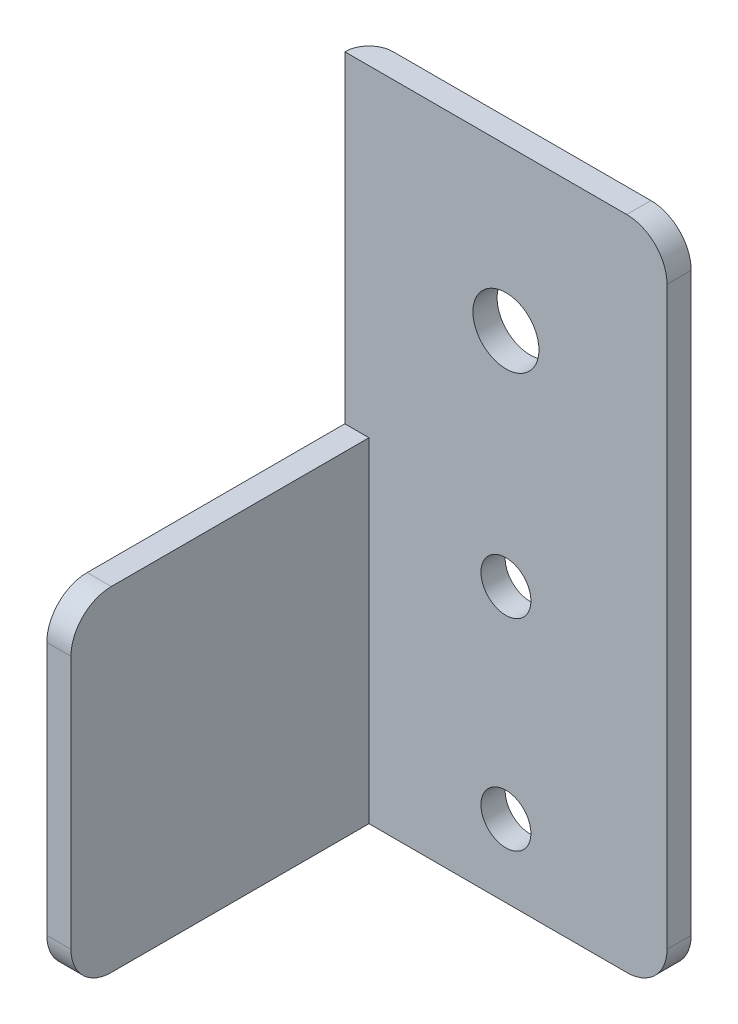
ISO-10303-21;
HEADER;
FILE_DESCRIPTION(('STEP AP214'),'2;1');
FILE_NAME('part.step','',(''),(''),'','','');
FILE_SCHEMA(('AUTOMOTIVE_DESIGN { 1 0 10303 214 1 1 1 1 }'));
ENDSEC;
DATA;
#1=APPLICATION_CONTEXT('core data for automotive mechanical design processes');
#2=APPLICATION_PROTOCOL_DEFINITION('international standard','automotive_design',2000,#1);
#3=PRODUCT_CONTEXT('',#1,'mechanical');
#4=PRODUCT('Part','Part','',(#3));
#5=PRODUCT_RELATED_PRODUCT_CATEGORY('part','',(#4));
#6=PRODUCT_DEFINITION_FORMATION('','',#4);
#7=PRODUCT_DEFINITION_CONTEXT('part definition',#1,'design');
#8=PRODUCT_DEFINITION('design','',#6,#7);
#9=PRODUCT_DEFINITION_SHAPE('','',#8);
#10=(LENGTH_UNIT() NAMED_UNIT(*) SI_UNIT(.MILLI.,.METRE.));
#11=(NAMED_UNIT(*) PLANE_ANGLE_UNIT() SI_UNIT($,.RADIAN.));
#12=(NAMED_UNIT(*) SI_UNIT($,.STERADIAN.) SOLID_ANGLE_UNIT());
#13=UNCERTAINTY_MEASURE_WITH_UNIT(LENGTH_MEASURE(1.E-05),#10,'distance_accuracy_value','');
#14=(GEOMETRIC_REPRESENTATION_CONTEXT(3) GLOBAL_UNCERTAINTY_ASSIGNED_CONTEXT((#13)) GLOBAL_UNIT_ASSIGNED_CONTEXT((#10,
#11,#12)) REPRESENTATION_CONTEXT('',''));
#15=CARTESIAN_POINT('',(0.,0.,0.));
#16=DIRECTION('',(0.,0.,1.));
#17=DIRECTION('',(1.,0.,0.));
#18=AXIS2_PLACEMENT_3D('',#15,#16,#17);
#19=CARTESIAN_POINT('',(3.00000000000002,81.5,3.));
#20=DIRECTION('',(0.,0.,-1.));
#21=DIRECTION('',(-1.,0.,0.));
#22=AXIS2_PLACEMENT_3D('',#19,#20,#21);
#23=PLANE('',#22);
#24=CARTESIAN_POINT('',(20.,34.,3.));
#25=DIRECTION('',(0.,0.,-1.));
#26=DIRECTION('',(-1.,0.,0.));
#27=AXIS2_PLACEMENT_3D('',#24,#25,#26);
#28=CIRCLE('',#27,3.1);
#29=CARTESIAN_POINT('',(16.9,34.,3.));
#30=VERTEX_POINT('',#29);
#31=EDGE_CURVE('E401',#30,#30,#28,.T.);
#32=ORIENTED_EDGE('',*,*,#31,.T.);
#33=EDGE_LOOP('',(#32));
#34=FACE_BOUND('',#33,.T.);
#35=CARTESIAN_POINT('',(20.,9.,3.));
#36=DIRECTION('',(0.,0.,-1.));
#37=DIRECTION('',(-1.,0.,0.));
#38=AXIS2_PLACEMENT_3D('',#35,#36,#37);
#39=CIRCLE('',#38,3.1);
#40=CARTESIAN_POINT('',(16.9,9.,3.));
#41=VERTEX_POINT('',#40);
#42=EDGE_CURVE('E393',#41,#41,#39,.T.);
#43=ORIENTED_EDGE('',*,*,#42,.T.);
#44=EDGE_LOOP('',(#43));
#45=FACE_BOUND('',#44,.T.);
#46=CARTESIAN_POINT('',(20.,61.5,3.));
#47=DIRECTION('',(0.,0.,-1.));
#48=DIRECTION('',(-1.,0.,0.));
#49=AXIS2_PLACEMENT_3D('',#46,#47,#48);
#50=CIRCLE('',#49,4.1);
#51=CARTESIAN_POINT('',(15.9,61.5,3.));
#52=VERTEX_POINT('',#51);
#53=EDGE_CURVE('E131',#52,#52,#50,.T.);
#54=ORIENTED_EDGE('',*,*,#53,.T.);
#55=EDGE_LOOP('',(#54));
#56=FACE_BOUND('',#55,.T.);
#57=DIRECTION('',(1.,0.,0.));
#58=VECTOR('',#57,1.);
#59=CARTESIAN_POINT('',(3.00000000000002,0.,3.));
#60=LINE('',#59,#58);
#61=CARTESIAN_POINT('',(3.,0.,3.));
#62=VERTEX_POINT('',#61);
#63=CARTESIAN_POINT('',(35.,0.,3.));
#64=VERTEX_POINT('',#63);
#65=EDGE_CURVE('E208',#62,#64,#60,.T.);
#66=ORIENTED_EDGE('',*,*,#65,.T.);
#67=CARTESIAN_POINT('',(35.,5.,3.));
#68=DIRECTION('',(0.,0.,-1.));
#69=DIRECTION('',(-1.,0.,0.));
#70=AXIS2_PLACEMENT_3D('',#67,#68,#69);
#71=CIRCLE('',#70,5.);
#72=CARTESIAN_POINT('',(40.,5.,3.));
#73=VERTEX_POINT('',#72);
#74=EDGE_CURVE('E188',#64,#73,#71,.F.);
#75=ORIENTED_EDGE('',*,*,#74,.T.);
#76=DIRECTION('',(0.,-1.,0.));
#77=VECTOR('',#76,1.);
#78=CARTESIAN_POINT('',(40.,81.5,3.));
#79=LINE('',#78,#77);
#80=CARTESIAN_POINT('',(40.,76.5,3.));
#81=VERTEX_POINT('',#80);
#82=EDGE_CURVE('E165',#81,#73,#79,.T.);
#83=ORIENTED_EDGE('',*,*,#82,.F.);
#84=CARTESIAN_POINT('',(35.,76.5,3.));
#85=DIRECTION('',(0.,0.,-1.));
#86=DIRECTION('',(-1.,0.,0.));
#87=AXIS2_PLACEMENT_3D('',#84,#85,#86);
#88=CIRCLE('',#87,5.);
#89=CARTESIAN_POINT('',(35.,81.5,3.));
#90=VERTEX_POINT('',#89);
#91=EDGE_CURVE('E186',#81,#90,#88,.F.);
#92=ORIENTED_EDGE('',*,*,#91,.T.);
#93=DIRECTION('',(1.,0.,0.));
#94=VECTOR('',#93,1.);
#95=CARTESIAN_POINT('',(3.00000000000002,81.5,3.));
#96=LINE('',#95,#94);
#97=CARTESIAN_POINT('',(0.,81.5,3.));
#98=VERTEX_POINT('',#97);
#99=EDGE_CURVE('E216',#98,#90,#96,.T.);
#100=ORIENTED_EDGE('',*,*,#99,.F.);
#101=DIRECTION('',(0.,-1.,0.));
#102=VECTOR('',#101,1.);
#103=CARTESIAN_POINT('',(0.,81.5,3.00000000000002));
#104=LINE('',#103,#102);
#105=CARTESIAN_POINT('',(0.,41.5,3.));
#106=VERTEX_POINT('',#105);
#107=EDGE_CURVE('E139',#98,#106,#104,.T.);
#108=ORIENTED_EDGE('',*,*,#107,.T.);
#109=DIRECTION('',(1.,0.,0.));
#110=VECTOR('',#109,1.);
#111=CARTESIAN_POINT('',(-7.,41.5,3.));
#112=LINE('',#111,#110);
#113=CARTESIAN_POINT('',(3.,41.5,3.));
#114=VERTEX_POINT('',#113);
#115=EDGE_CURVE('E125',#106,#114,#112,.T.);
#116=ORIENTED_EDGE('',*,*,#115,.T.);
#117=DIRECTION('',(0.,-1.,0.));
#118=VECTOR('',#117,1.);
#119=CARTESIAN_POINT('',(3.,81.5,3.));
#120=LINE('',#119,#118);
#121=EDGE_CURVE('E136',#114,#62,#120,.T.);
#122=ORIENTED_EDGE('',*,*,#121,.T.);
#123=EDGE_LOOP('',(#66,#75,#83,#92,#100,#108,#116,#122));
#124=FACE_BOUND('',#123,.T.);
#125=ADVANCED_FACE('F32',(#34,#45,#56,#124),#23,.F.);
#126=CARTESIAN_POINT('',(40.,81.5,0.));
#127=DIRECTION('',(1.,0.,0.));
#128=DIRECTION('',(0.,0.,-1.));
#129=AXIS2_PLACEMENT_3D('',#126,#127,#128);
#130=PLANE('',#129);
#131=ORIENTED_EDGE('',*,*,#82,.T.);
#132=DIRECTION('',(0.,0.,1.));
#133=VECTOR('',#132,1.);
#134=CARTESIAN_POINT('',(40.,5.,0.));
#135=LINE('',#134,#133);
#136=CARTESIAN_POINT('',(40.,5.,0.));
#137=VERTEX_POINT('',#136);
#138=EDGE_CURVE('E53',#73,#137,#135,.F.);
#139=ORIENTED_EDGE('',*,*,#138,.T.);
#140=DIRECTION('',(0.,-1.,0.));
#141=VECTOR('',#140,1.);
#142=CARTESIAN_POINT('',(40.,81.5,0.));
#143=LINE('',#142,#141);
#144=CARTESIAN_POINT('',(40.,76.5,0.));
#145=VERTEX_POINT('',#144);
#146=EDGE_CURVE('E163',#145,#137,#143,.T.);
#147=ORIENTED_EDGE('',*,*,#146,.F.);
#148=DIRECTION('',(0.,0.,1.));
#149=VECTOR('',#148,1.);
#150=CARTESIAN_POINT('',(40.,76.5,3.));
#151=LINE('',#150,#149);
#152=EDGE_CURVE('E190',#145,#81,#151,.T.);
#153=ORIENTED_EDGE('',*,*,#152,.T.);
#154=EDGE_LOOP('',(#131,#139,#147,#153));
#155=FACE_BOUND('',#154,.T.);
#156=ADVANCED_FACE('F212',(#155),#130,.T.);
#157=CARTESIAN_POINT('',(3.00000000000002,81.5,0.));
#158=DIRECTION('',(0.,0.,-1.));
#159=DIRECTION('',(-1.,0.,0.));
#160=AXIS2_PLACEMENT_3D('',#157,#158,#159);
#161=PLANE('',#160);
#162=CARTESIAN_POINT('',(20.,34.,0.));
#163=DIRECTION('',(0.,0.,-1.));
#164=DIRECTION('',(-1.,0.,0.));
#165=AXIS2_PLACEMENT_3D('',#162,#163,#164);
#166=CIRCLE('',#165,3.1);
#167=CARTESIAN_POINT('',(16.9,34.,0.));
#168=VERTEX_POINT('',#167);
#169=EDGE_CURVE('E403',#168,#168,#166,.T.);
#170=ORIENTED_EDGE('',*,*,#169,.F.);
#171=EDGE_LOOP('',(#170));
#172=FACE_BOUND('',#171,.T.);
#173=CARTESIAN_POINT('',(20.,9.,0.));
#174=DIRECTION('',(0.,0.,-1.));
#175=DIRECTION('',(-1.,0.,0.));
#176=AXIS2_PLACEMENT_3D('',#173,#174,#175);
#177=CIRCLE('',#176,3.1);
#178=CARTESIAN_POINT('',(16.9,9.,0.));
#179=VERTEX_POINT('',#178);
#180=EDGE_CURVE('E398',#179,#179,#177,.T.);
#181=ORIENTED_EDGE('',*,*,#180,.F.);
#182=EDGE_LOOP('',(#181));
#183=FACE_BOUND('',#182,.T.);
#184=CARTESIAN_POINT('',(20.,61.5,0.));
#185=DIRECTION('',(0.,0.,-1.));
#186=DIRECTION('',(-1.,0.,0.));
#187=AXIS2_PLACEMENT_3D('',#184,#185,#186);
#188=CIRCLE('',#187,4.1);
#189=CARTESIAN_POINT('',(15.9,61.5,0.));
#190=VERTEX_POINT('',#189);
#191=EDGE_CURVE('E388',#190,#190,#188,.T.);
#192=ORIENTED_EDGE('',*,*,#191,.F.);
#193=EDGE_LOOP('',(#192));
#194=FACE_BOUND('',#193,.T.);
#195=ORIENTED_EDGE('',*,*,#146,.T.);
#196=CARTESIAN_POINT('',(35.,5.,0.));
#197=DIRECTION('',(0.,0.,-1.));
#198=DIRECTION('',(-1.,0.,0.));
#199=AXIS2_PLACEMENT_3D('',#196,#197,#198);
#200=CIRCLE('',#199,5.);
#201=CARTESIAN_POINT('',(35.,0.,0.));
#202=VERTEX_POINT('',#201);
#203=EDGE_CURVE('E40',#137,#202,#200,.T.);
#204=ORIENTED_EDGE('',*,*,#203,.T.);
#205=DIRECTION('',(1.,0.,0.));
#206=VECTOR('',#205,1.);
#207=CARTESIAN_POINT('',(3.00000000000002,0.,0.));
#208=LINE('',#207,#206);
#209=CARTESIAN_POINT('',(3.,0.,0.));
#210=VERTEX_POINT('',#209);
#211=EDGE_CURVE('E200',#210,#202,#208,.T.);
#212=ORIENTED_EDGE('',*,*,#211,.F.);
#213=DIRECTION('',(0.,-1.,0.));
#214=VECTOR('',#213,1.);
#215=CARTESIAN_POINT('',(3.,81.5,0.));
#216=LINE('',#215,#214);
#217=CARTESIAN_POINT('',(3.,81.5,0.));
#218=VERTEX_POINT('',#217);
#219=EDGE_CURVE('E161',#218,#210,#216,.T.);
#220=ORIENTED_EDGE('',*,*,#219,.F.);
#221=DIRECTION('',(1.,0.,0.));
#222=VECTOR('',#221,1.);
#223=CARTESIAN_POINT('',(3.00000000000002,81.5,0.));
#224=LINE('',#223,#222);
#225=CARTESIAN_POINT('',(35.,81.5,0.));
#226=VERTEX_POINT('',#225);
#227=EDGE_CURVE('E152',#218,#226,#224,.T.);
#228=ORIENTED_EDGE('',*,*,#227,.T.);
#229=CARTESIAN_POINT('',(35.,76.5,0.));
#230=DIRECTION('',(0.,0.,-1.));
#231=DIRECTION('',(-1.,0.,0.));
#232=AXIS2_PLACEMENT_3D('',#229,#230,#231);
#233=CIRCLE('',#232,5.);
#234=EDGE_CURVE('E194',#226,#145,#233,.T.);
#235=ORIENTED_EDGE('',*,*,#234,.T.);
#236=EDGE_LOOP('',(#195,#204,#212,#220,#228,#235));
#237=FACE_BOUND('',#236,.T.);
#238=ADVANCED_FACE('F199',(#172,#183,#194,#237),#161,.T.);
#239=CARTESIAN_POINT('',(3.,81.5,3.));
#240=DIRECTION('',(0.,-1.,0.));
#241=DIRECTION('',(0.,0.,-1.));
#242=AXIS2_PLACEMENT_3D('',#239,#240,#241);
#243=CYLINDRICAL_SURFACE('',#242,3.);
#244=CARTESIAN_POINT('',(3.,0.,3.));
#245=DIRECTION('',(0.,-1.,0.));
#246=DIRECTION('',(0.,0.,-1.));
#247=AXIS2_PLACEMENT_3D('',#244,#245,#246);
#248=CIRCLE('',#247,3.);
#249=CARTESIAN_POINT('',(0.,0.,3.00000000000002));
#250=VERTEX_POINT('',#249);
#251=EDGE_CURVE('E207',#250,#210,#248,.T.);
#252=ORIENTED_EDGE('',*,*,#251,.F.);
#253=EDGE_CURVE('E159',#106,#250,#104,.T.);
#254=ORIENTED_EDGE('',*,*,#253,.F.);
#255=ORIENTED_EDGE('',*,*,#107,.F.);
#256=CARTESIAN_POINT('',(3.,81.5,3.));
#257=DIRECTION('',(0.,-1.,0.));
#258=DIRECTION('',(0.,0.,-1.));
#259=AXIS2_PLACEMENT_3D('',#256,#257,#258);
#260=CIRCLE('',#259,3.);
#261=EDGE_CURVE('E146',#98,#218,#260,.T.);
#262=ORIENTED_EDGE('',*,*,#261,.T.);
#263=ORIENTED_EDGE('',*,*,#219,.T.);
#264=EDGE_LOOP('',(#252,#254,#255,#262,#263));
#265=FACE_BOUND('',#264,.T.);
#266=ADVANCED_FACE('F233',(#265),#243,.T.);
#267=CARTESIAN_POINT('',(0.,81.5,3.00000000000002));
#268=DIRECTION('',(-1.,0.,0.));
#269=DIRECTION('',(0.,0.,1.));
#270=AXIS2_PLACEMENT_3D('',#267,#268,#269);
#271=PLANE('',#270);
#272=DIRECTION('',(0.,-1.,0.));
#273=VECTOR('',#272,1.);
#274=CARTESIAN_POINT('',(0.,81.5,40.));
#275=LINE('',#274,#273);
#276=CARTESIAN_POINT('',(0.,36.5,40.));
#277=VERTEX_POINT('',#276);
#278=CARTESIAN_POINT('',(0.,5.,40.));
#279=VERTEX_POINT('',#278);
#280=EDGE_CURVE('E149',#277,#279,#275,.T.);
#281=ORIENTED_EDGE('',*,*,#280,.F.);
#282=CARTESIAN_POINT('',(0.,36.5,35.));
#283=DIRECTION('',(-1.,0.,0.));
#284=DIRECTION('',(0.,0.,1.));
#285=AXIS2_PLACEMENT_3D('',#282,#283,#284);
#286=CIRCLE('',#285,5.);
#287=CARTESIAN_POINT('',(0.,41.5,35.));
#288=VERTEX_POINT('',#287);
#289=EDGE_CURVE('E178',#277,#288,#286,.T.);
#290=ORIENTED_EDGE('',*,*,#289,.T.);
#291=DIRECTION('',(0.,0.,1.));
#292=VECTOR('',#291,1.);
#293=CARTESIAN_POINT('',(0.,41.5,3.00000000000001));
#294=LINE('',#293,#292);
#295=EDGE_CURVE('E140',#106,#288,#294,.T.);
#296=ORIENTED_EDGE('',*,*,#295,.F.);
#297=ORIENTED_EDGE('',*,*,#253,.T.);
#298=DIRECTION('',(0.,0.,-1.));
#299=VECTOR('',#298,1.);
#300=CARTESIAN_POINT('',(0.,0.,3.00000000000002));
#301=LINE('',#300,#299);
#302=CARTESIAN_POINT('',(0.,0.,35.));
#303=VERTEX_POINT('',#302);
#304=EDGE_CURVE('E221',#303,#250,#301,.T.);
#305=ORIENTED_EDGE('',*,*,#304,.F.);
#306=CARTESIAN_POINT('',(0.,5.,35.));
#307=DIRECTION('',(-1.,0.,0.));
#308=DIRECTION('',(0.,0.,1.));
#309=AXIS2_PLACEMENT_3D('',#306,#307,#308);
#310=CIRCLE('',#309,5.);
#311=EDGE_CURVE('E176',#303,#279,#310,.T.);
#312=ORIENTED_EDGE('',*,*,#311,.T.);
#313=EDGE_LOOP('',(#281,#290,#296,#297,#305,#312));
#314=FACE_BOUND('',#313,.T.);
#315=ADVANCED_FACE('F231',(#314),#271,.T.);
#316=CARTESIAN_POINT('',(3.,81.5,40.));
#317=DIRECTION('',(0.,0.,1.));
#318=DIRECTION('',(1.,0.,0.));
#319=AXIS2_PLACEMENT_3D('',#316,#317,#318);
#320=PLANE('',#319);
#321=DIRECTION('',(0.,-1.,0.));
#322=VECTOR('',#321,1.);
#323=CARTESIAN_POINT('',(3.,81.5,40.));
#324=LINE('',#323,#322);
#325=CARTESIAN_POINT('',(3.,36.5,40.));
#326=VERTEX_POINT('',#325);
#327=CARTESIAN_POINT('',(3.,5.,40.));
#328=VERTEX_POINT('',#327);
#329=EDGE_CURVE('E145',#326,#328,#324,.T.);
#330=ORIENTED_EDGE('',*,*,#329,.F.);
#331=DIRECTION('',(1.,0.,0.));
#332=VECTOR('',#331,1.);
#333=CARTESIAN_POINT('',(0.,36.5,40.));
#334=LINE('',#333,#332);
#335=EDGE_CURVE('E174',#326,#277,#334,.F.);
#336=ORIENTED_EDGE('',*,*,#335,.T.);
#337=ORIENTED_EDGE('',*,*,#280,.T.);
#338=DIRECTION('',(-1.,0.,0.));
#339=VECTOR('',#338,1.);
#340=CARTESIAN_POINT('',(3.,5.,40.));
#341=LINE('',#340,#339);
#342=EDGE_CURVE('E172',#279,#328,#341,.F.);
#343=ORIENTED_EDGE('',*,*,#342,.T.);
#344=EDGE_LOOP('',(#330,#336,#337,#343));
#345=FACE_BOUND('',#344,.T.);
#346=ADVANCED_FACE('F240',(#345),#320,.T.);
#347=CARTESIAN_POINT('',(3.,81.5,3.00000000000002));
#348=DIRECTION('',(-1.,0.,0.));
#349=DIRECTION('',(0.,0.,1.));
#350=AXIS2_PLACEMENT_3D('',#347,#348,#349);
#351=PLANE('',#350);
#352=DIRECTION('',(0.,0.,-1.));
#353=VECTOR('',#352,1.);
#354=CARTESIAN_POINT('',(3.,41.5,3.));
#355=LINE('',#354,#353);
#356=CARTESIAN_POINT('',(3.,41.5,35.));
#357=VERTEX_POINT('',#356);
#358=EDGE_CURVE('E121',#357,#114,#355,.T.);
#359=ORIENTED_EDGE('',*,*,#358,.F.);
#360=CARTESIAN_POINT('',(3.,36.5,35.));
#361=DIRECTION('',(-1.,0.,0.));
#362=DIRECTION('',(0.,0.,1.));
#363=AXIS2_PLACEMENT_3D('',#360,#361,#362);
#364=CIRCLE('',#363,5.);
#365=EDGE_CURVE('E170',#357,#326,#364,.F.);
#366=ORIENTED_EDGE('',*,*,#365,.T.);
#367=ORIENTED_EDGE('',*,*,#329,.T.);
#368=CARTESIAN_POINT('',(3.,5.,35.));
#369=DIRECTION('',(-1.,0.,0.));
#370=DIRECTION('',(0.,0.,1.));
#371=AXIS2_PLACEMENT_3D('',#368,#369,#370);
#372=CIRCLE('',#371,5.);
#373=CARTESIAN_POINT('',(3.,0.,35.));
#374=VERTEX_POINT('',#373);
#375=EDGE_CURVE('E168',#328,#374,#372,.F.);
#376=ORIENTED_EDGE('',*,*,#375,.T.);
#377=DIRECTION('',(0.,0.,-1.));
#378=VECTOR('',#377,1.);
#379=CARTESIAN_POINT('',(3.,0.,3.00000000000002));
#380=LINE('',#379,#378);
#381=EDGE_CURVE('E144',#374,#62,#380,.T.);
#382=ORIENTED_EDGE('',*,*,#381,.T.);
#383=ORIENTED_EDGE('',*,*,#121,.F.);
#384=EDGE_LOOP('',(#359,#366,#367,#376,#382,#383));
#385=FACE_BOUND('',#384,.T.);
#386=ADVANCED_FACE('F142',(#385),#351,.F.);
#387=CARTESIAN_POINT('',(3.,81.5,3.));
#388=DIRECTION('',(0.,-1.,0.));
#389=DIRECTION('',(-1.,0.,0.));
#390=AXIS2_PLACEMENT_3D('',#387,#388,#389);
#391=PLANE('',#390);
#392=ORIENTED_EDGE('',*,*,#99,.T.);
#393=DIRECTION('',(0.,0.,1.));
#394=VECTOR('',#393,1.);
#395=CARTESIAN_POINT('',(35.,81.5,0.));
#396=LINE('',#395,#394);
#397=EDGE_CURVE('E11',#90,#226,#396,.F.);
#398=ORIENTED_EDGE('',*,*,#397,.T.);
#399=ORIENTED_EDGE('',*,*,#227,.F.);
#400=ORIENTED_EDGE('',*,*,#261,.F.);
#401=EDGE_LOOP('',(#392,#398,#399,#400));
#402=FACE_BOUND('',#401,.T.);
#403=ADVANCED_FACE('F218',(#402),#391,.F.);
#404=CARTESIAN_POINT('',(3.,0.,3.));
#405=DIRECTION('',(0.,-1.,0.));
#406=DIRECTION('',(-1.,0.,0.));
#407=AXIS2_PLACEMENT_3D('',#404,#405,#406);
#408=PLANE('',#407);
#409=ORIENTED_EDGE('',*,*,#381,.F.);
#410=DIRECTION('',(-1.,0.,0.));
#411=VECTOR('',#410,1.);
#412=CARTESIAN_POINT('',(3.,0.,35.));
#413=LINE('',#412,#411);
#414=EDGE_CURVE('E183',#374,#303,#413,.T.);
#415=ORIENTED_EDGE('',*,*,#414,.T.);
#416=ORIENTED_EDGE('',*,*,#304,.T.);
#417=ORIENTED_EDGE('',*,*,#251,.T.);
#418=ORIENTED_EDGE('',*,*,#211,.T.);
#419=DIRECTION('',(0.,0.,1.));
#420=VECTOR('',#419,1.);
#421=CARTESIAN_POINT('',(35.,0.,3.));
#422=LINE('',#421,#420);
#423=EDGE_CURVE('E180',#202,#64,#422,.T.);
#424=ORIENTED_EDGE('',*,*,#423,.T.);
#425=ORIENTED_EDGE('',*,*,#65,.F.);
#426=EDGE_LOOP('',(#409,#415,#416,#417,#418,#424,#425));
#427=FACE_BOUND('',#426,.T.);
#428=ADVANCED_FACE('F205',(#427),#408,.T.);
#429=CARTESIAN_POINT('',(-7.,41.5,3.));
#430=DIRECTION('',(0.,-1.,0.));
#431=DIRECTION('',(0.,0.,-1.));
#432=AXIS2_PLACEMENT_3D('',#429,#430,#431);
#433=PLANE('',#432);
#434=ORIENTED_EDGE('',*,*,#295,.T.);
#435=DIRECTION('',(1.,0.,0.));
#436=VECTOR('',#435,1.);
#437=CARTESIAN_POINT('',(3.,41.5,35.));
#438=LINE('',#437,#436);
#439=EDGE_CURVE('E128',#288,#357,#438,.T.);
#440=ORIENTED_EDGE('',*,*,#439,.T.);
#441=ORIENTED_EDGE('',*,*,#358,.T.);
#442=ORIENTED_EDGE('',*,*,#115,.F.);
#443=EDGE_LOOP('',(#434,#440,#441,#442));
#444=FACE_BOUND('',#443,.T.);
#445=ADVANCED_FACE('F124',(#444),#433,.F.);
#446=CARTESIAN_POINT('',(20.,61.5,10.));
#447=DIRECTION('',(0.,0.,-1.));
#448=DIRECTION('',(-1.,0.,0.));
#449=AXIS2_PLACEMENT_3D('',#446,#447,#448);
#450=CYLINDRICAL_SURFACE('',#449,4.1);
#451=ORIENTED_EDGE('',*,*,#191,.T.);
#452=EDGE_LOOP('',(#451));
#453=FACE_BOUND('',#452,.T.);
#454=ORIENTED_EDGE('',*,*,#53,.F.);
#455=EDGE_LOOP('',(#454));
#456=FACE_BOUND('',#455,.T.);
#457=ADVANCED_FACE('F295',(#453,#456),#450,.F.);
#458=CARTESIAN_POINT('',(20.,9.,10.));
#459=DIRECTION('',(0.,0.,-1.));
#460=DIRECTION('',(-1.,0.,0.));
#461=AXIS2_PLACEMENT_3D('',#458,#459,#460);
#462=CYLINDRICAL_SURFACE('',#461,3.1);
#463=ORIENTED_EDGE('',*,*,#180,.T.);
#464=EDGE_LOOP('',(#463));
#465=FACE_BOUND('',#464,.T.);
#466=ORIENTED_EDGE('',*,*,#42,.F.);
#467=EDGE_LOOP('',(#466));
#468=FACE_BOUND('',#467,.T.);
#469=ADVANCED_FACE('F361',(#465,#468),#462,.F.);
#470=CARTESIAN_POINT('',(20.,34.,10.));
#471=DIRECTION('',(0.,0.,-1.));
#472=DIRECTION('',(-1.,0.,0.));
#473=AXIS2_PLACEMENT_3D('',#470,#471,#472);
#474=CYLINDRICAL_SURFACE('',#473,3.1);
#475=ORIENTED_EDGE('',*,*,#169,.T.);
#476=EDGE_LOOP('',(#475));
#477=FACE_BOUND('',#476,.T.);
#478=ORIENTED_EDGE('',*,*,#31,.F.);
#479=EDGE_LOOP('',(#478));
#480=FACE_BOUND('',#479,.T.);
#481=ADVANCED_FACE('F258',(#477,#480),#474,.F.);
#482=CARTESIAN_POINT('',(-7.,36.5,35.));
#483=DIRECTION('',(-1.,0.,0.));
#484=DIRECTION('',(0.,-1.,0.));
#485=AXIS2_PLACEMENT_3D('',#482,#483,#484);
#486=CYLINDRICAL_SURFACE('',#485,5.);
#487=ORIENTED_EDGE('',*,*,#289,.F.);
#488=ORIENTED_EDGE('',*,*,#335,.F.);
#489=ORIENTED_EDGE('',*,*,#365,.F.);
#490=ORIENTED_EDGE('',*,*,#439,.F.);
#491=EDGE_LOOP('',(#487,#488,#489,#490));
#492=FACE_BOUND('',#491,.T.);
#493=ADVANCED_FACE('F254',(#492),#486,.T.);
#494=CARTESIAN_POINT('',(3.,5.,35.));
#495=DIRECTION('',(-1.,0.,0.));
#496=DIRECTION('',(0.,0.,1.));
#497=AXIS2_PLACEMENT_3D('',#494,#495,#496);
#498=CYLINDRICAL_SURFACE('',#497,5.);
#499=ORIENTED_EDGE('',*,*,#375,.F.);
#500=ORIENTED_EDGE('',*,*,#342,.F.);
#501=ORIENTED_EDGE('',*,*,#311,.F.);
#502=ORIENTED_EDGE('',*,*,#414,.F.);
#503=EDGE_LOOP('',(#499,#500,#501,#502));
#504=FACE_BOUND('',#503,.T.);
#505=ADVANCED_FACE('F257',(#504),#498,.T.);
#506=CARTESIAN_POINT('',(35.,5.,3.));
#507=DIRECTION('',(0.,0.,1.));
#508=DIRECTION('',(1.,0.,0.));
#509=AXIS2_PLACEMENT_3D('',#506,#507,#508);
#510=CYLINDRICAL_SURFACE('',#509,5.);
#511=ORIENTED_EDGE('',*,*,#203,.F.);
#512=ORIENTED_EDGE('',*,*,#138,.F.);
#513=ORIENTED_EDGE('',*,*,#74,.F.);
#514=ORIENTED_EDGE('',*,*,#423,.F.);
#515=EDGE_LOOP('',(#511,#512,#513,#514));
#516=FACE_BOUND('',#515,.T.);
#517=ADVANCED_FACE('F210',(#516),#510,.T.);
#518=CARTESIAN_POINT('',(35.,76.5,0.));
#519=DIRECTION('',(0.,0.,-1.));
#520=DIRECTION('',(-1.,0.,0.));
#521=AXIS2_PLACEMENT_3D('',#518,#519,#520);
#522=CYLINDRICAL_SURFACE('',#521,5.);
#523=ORIENTED_EDGE('',*,*,#234,.F.);
#524=ORIENTED_EDGE('',*,*,#397,.F.);
#525=ORIENTED_EDGE('',*,*,#91,.F.);
#526=ORIENTED_EDGE('',*,*,#152,.F.);
#527=EDGE_LOOP('',(#523,#524,#525,#526));
#528=FACE_BOUND('',#527,.T.);
#529=ADVANCED_FACE('F34',(#528),#522,.T.);
#530=CLOSED_SHELL('',(#125,#156,#238,#266,#315,#346,#386,#403,#428,#445,#457,#469,#481,#493,
#505,#517,#529));
#531=MANIFOLD_SOLID_BREP('B2',#530);
#532=ADVANCED_BREP_SHAPE_REPRESENTATION('',(#18,#531),#14);
#533=SHAPE_DEFINITION_REPRESENTATION(#9,#532);
ENDSEC;
END-ISO-10303-21;
